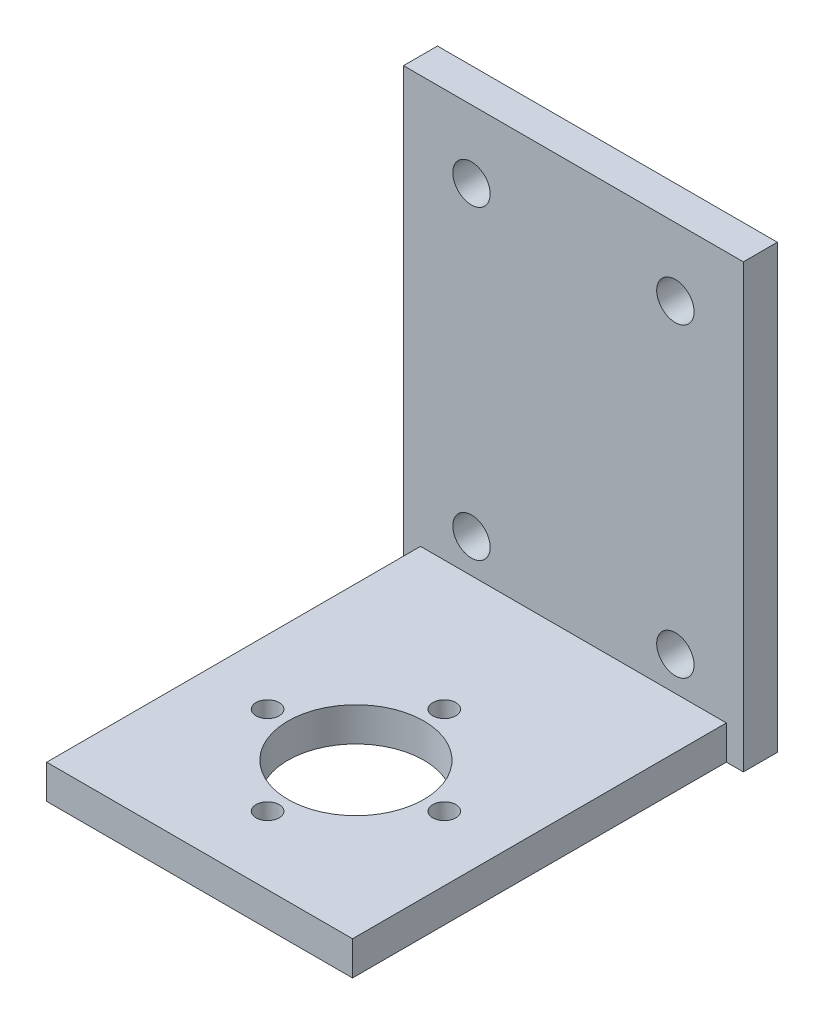
ISO-10303-21;
HEADER;
FILE_DESCRIPTION(('STEP AP214'),'2;1');
FILE_NAME('part.step','',(''),(''),'','','');
FILE_SCHEMA(('AUTOMOTIVE_DESIGN { 1 0 10303 214 1 1 1 1 }'));
ENDSEC;
DATA;
#1=APPLICATION_CONTEXT('core data for automotive mechanical design processes');
#2=APPLICATION_PROTOCOL_DEFINITION('international standard','automotive_design',2000,#1);
#3=PRODUCT_CONTEXT('',#1,'mechanical');
#4=PRODUCT('Part','Part','',(#3));
#5=PRODUCT_RELATED_PRODUCT_CATEGORY('part','',(#4));
#6=PRODUCT_DEFINITION_FORMATION('','',#4);
#7=PRODUCT_DEFINITION_CONTEXT('part definition',#1,'design');
#8=PRODUCT_DEFINITION('design','',#6,#7);
#9=PRODUCT_DEFINITION_SHAPE('','',#8);
#10=(LENGTH_UNIT() NAMED_UNIT(*) SI_UNIT(.MILLI.,.METRE.));
#11=(NAMED_UNIT(*) PLANE_ANGLE_UNIT() SI_UNIT($,.RADIAN.));
#12=(NAMED_UNIT(*) SI_UNIT($,.STERADIAN.) SOLID_ANGLE_UNIT());
#13=UNCERTAINTY_MEASURE_WITH_UNIT(LENGTH_MEASURE(1.E-05),#10,'distance_accuracy_value','');
#14=(GEOMETRIC_REPRESENTATION_CONTEXT(3) GLOBAL_UNCERTAINTY_ASSIGNED_CONTEXT((#13)) GLOBAL_UNIT_ASSIGNED_CONTEXT((#10,
#11,#12)) REPRESENTATION_CONTEXT('',''));
#15=CARTESIAN_POINT('',(0.,0.,0.));
#16=DIRECTION('',(0.,0.,1.));
#17=DIRECTION('',(1.,0.,0.));
#18=AXIS2_PLACEMENT_3D('',#15,#16,#17);
#19=CARTESIAN_POINT('',(0.,0.,5.));
#20=DIRECTION('',(0.,0.,-1.));
#21=DIRECTION('',(-1.,0.,0.));
#22=AXIS2_PLACEMENT_3D('',#19,#20,#21);
#23=PLANE('',#22);
#24=CARTESIAN_POINT('',(15.,22.5,5.));
#25=DIRECTION('',(0.,0.,1.));
#26=DIRECTION('',(1.,0.,0.));
#27=AXIS2_PLACEMENT_3D('',#24,#25,#26);
#28=CIRCLE('',#27,2.75);
#29=CARTESIAN_POINT('',(17.75,22.5,5.));
#30=VERTEX_POINT('',#29);
#31=EDGE_CURVE('E372',#30,#30,#28,.T.);
#32=ORIENTED_EDGE('',*,*,#31,.F.);
#33=EDGE_LOOP('',(#32));
#34=FACE_BOUND('',#33,.T.);
#35=CARTESIAN_POINT('',(-15.,-22.5,5.));
#36=DIRECTION('',(0.,0.,1.));
#37=DIRECTION('',(1.,0.,0.));
#38=AXIS2_PLACEMENT_3D('',#35,#36,#37);
#39=CIRCLE('',#38,2.75);
#40=CARTESIAN_POINT('',(-12.25,-22.5,5.));
#41=VERTEX_POINT('',#40);
#42=EDGE_CURVE('E379',#41,#41,#39,.T.);
#43=ORIENTED_EDGE('',*,*,#42,.F.);
#44=EDGE_LOOP('',(#43));
#45=FACE_BOUND('',#44,.T.);
#46=CARTESIAN_POINT('',(15.,-22.5,5.));
#47=DIRECTION('',(0.,0.,1.));
#48=DIRECTION('',(1.,0.,0.));
#49=AXIS2_PLACEMENT_3D('',#46,#47,#48);
#50=CIRCLE('',#49,2.75);
#51=CARTESIAN_POINT('',(17.75,-22.5,5.));
#52=VERTEX_POINT('',#51);
#53=EDGE_CURVE('E392',#52,#52,#50,.T.);
#54=ORIENTED_EDGE('',*,*,#53,.F.);
#55=EDGE_LOOP('',(#54));
#56=FACE_BOUND('',#55,.T.);
#57=CARTESIAN_POINT('',(-15.,22.5,5.));
#58=DIRECTION('',(0.,0.,1.));
#59=DIRECTION('',(1.,0.,0.));
#60=AXIS2_PLACEMENT_3D('',#57,#58,#59);
#61=CIRCLE('',#60,2.75);
#62=CARTESIAN_POINT('',(-12.25,22.5,5.));
#63=VERTEX_POINT('',#62);
#64=EDGE_CURVE('E374',#63,#63,#61,.T.);
#65=ORIENTED_EDGE('',*,*,#64,.F.);
#66=EDGE_LOOP('',(#65));
#67=FACE_BOUND('',#66,.T.);
#68=DIRECTION('',(0.,-1.,0.));
#69=VECTOR('',#68,1.);
#70=CARTESIAN_POINT('',(-22.5,-32.5,5.));
#71=LINE('',#70,#69);
#72=CARTESIAN_POINT('',(-22.5,-27.5,5.));
#73=VERTEX_POINT('',#72);
#74=CARTESIAN_POINT('',(-22.5,-32.5,5.));
#75=VERTEX_POINT('',#74);
#76=EDGE_CURVE('E57',#73,#75,#71,.T.);
#77=ORIENTED_EDGE('',*,*,#76,.F.);
#78=DIRECTION('',(-1.,0.,0.));
#79=VECTOR('',#78,1.);
#80=CARTESIAN_POINT('',(-22.5,-27.5,5.));
#81=LINE('',#80,#79);
#82=CARTESIAN_POINT('',(22.5,-27.5,5.));
#83=VERTEX_POINT('',#82);
#84=EDGE_CURVE('E121',#83,#73,#81,.T.);
#85=ORIENTED_EDGE('',*,*,#84,.F.);
#86=DIRECTION('',(0.,1.,0.));
#87=VECTOR('',#86,1.);
#88=CARTESIAN_POINT('',(22.5,-27.5,5.));
#89=LINE('',#88,#87);
#90=CARTESIAN_POINT('',(22.5,-32.5,5.));
#91=VERTEX_POINT('',#90);
#92=EDGE_CURVE('E65',#91,#83,#89,.T.);
#93=ORIENTED_EDGE('',*,*,#92,.F.);
#94=DIRECTION('',(1.,0.,0.));
#95=VECTOR('',#94,1.);
#96=CARTESIAN_POINT('',(25.,-32.5,5.));
#97=LINE('',#96,#95);
#98=CARTESIAN_POINT('',(25.,-32.5,5.));
#99=VERTEX_POINT('',#98);
#100=EDGE_CURVE('E141',#91,#99,#97,.T.);
#101=ORIENTED_EDGE('',*,*,#100,.T.);
#102=DIRECTION('',(0.,1.,0.));
#103=VECTOR('',#102,1.);
#104=CARTESIAN_POINT('',(25.,-32.5,5.));
#105=LINE('',#104,#103);
#106=CARTESIAN_POINT('',(25.,32.5,5.));
#107=VERTEX_POINT('',#106);
#108=EDGE_CURVE('E148',#99,#107,#105,.T.);
#109=ORIENTED_EDGE('',*,*,#108,.T.);
#110=DIRECTION('',(-1.,0.,0.));
#111=VECTOR('',#110,1.);
#112=CARTESIAN_POINT('',(25.,32.5,5.));
#113=LINE('',#112,#111);
#114=CARTESIAN_POINT('',(-25.,32.5,5.));
#115=VERTEX_POINT('',#114);
#116=EDGE_CURVE('E140',#107,#115,#113,.T.);
#117=ORIENTED_EDGE('',*,*,#116,.T.);
#118=DIRECTION('',(0.,-1.,0.));
#119=VECTOR('',#118,1.);
#120=CARTESIAN_POINT('',(-25.,-32.5,5.));
#121=LINE('',#120,#119);
#122=CARTESIAN_POINT('',(-25.,-32.5,5.));
#123=VERTEX_POINT('',#122);
#124=EDGE_CURVE('E136',#115,#123,#121,.T.);
#125=ORIENTED_EDGE('',*,*,#124,.T.);
#126=EDGE_CURVE('E145',#123,#75,#97,.T.);
#127=ORIENTED_EDGE('',*,*,#126,.T.);
#128=EDGE_LOOP('',(#77,#85,#93,#101,#109,#117,#125,#127));
#129=FACE_BOUND('',#128,.T.);
#130=ADVANCED_FACE('F39',(#34,#45,#56,#67,#129),#23,.F.);
#131=CARTESIAN_POINT('',(25.,32.5,5.));
#132=DIRECTION('',(0.,-1.,0.));
#133=DIRECTION('',(0.,0.,-1.));
#134=AXIS2_PLACEMENT_3D('',#131,#132,#133);
#135=PLANE('',#134);
#136=DIRECTION('',(-1.,0.,0.));
#137=VECTOR('',#136,1.);
#138=CARTESIAN_POINT('',(25.,32.5,0.));
#139=LINE('',#138,#137);
#140=CARTESIAN_POINT('',(25.,32.5,0.));
#141=VERTEX_POINT('',#140);
#142=CARTESIAN_POINT('',(-25.,32.5,0.));
#143=VERTEX_POINT('',#142);
#144=EDGE_CURVE('E126',#141,#143,#139,.T.);
#145=ORIENTED_EDGE('',*,*,#144,.T.);
#146=DIRECTION('',(0.,0.,-1.));
#147=VECTOR('',#146,1.);
#148=CARTESIAN_POINT('',(-25.,32.5,5.));
#149=LINE('',#148,#147);
#150=EDGE_CURVE('E11',#115,#143,#149,.T.);
#151=ORIENTED_EDGE('',*,*,#150,.F.);
#152=ORIENTED_EDGE('',*,*,#116,.F.);
#153=DIRECTION('',(0.,0.,-1.));
#154=VECTOR('',#153,1.);
#155=CARTESIAN_POINT('',(25.,32.5,5.));
#156=LINE('',#155,#154);
#157=EDGE_CURVE('E150',#107,#141,#156,.T.);
#158=ORIENTED_EDGE('',*,*,#157,.T.);
#159=EDGE_LOOP('',(#145,#151,#152,#158));
#160=FACE_BOUND('',#159,.T.);
#161=ADVANCED_FACE('F41',(#160),#135,.F.);
#162=CARTESIAN_POINT('',(-25.,-32.5,5.));
#163=DIRECTION('',(1.,0.,0.));
#164=DIRECTION('',(0.,0.,-1.));
#165=AXIS2_PLACEMENT_3D('',#162,#163,#164);
#166=PLANE('',#165);
#167=DIRECTION('',(0.,-1.,0.));
#168=VECTOR('',#167,1.);
#169=CARTESIAN_POINT('',(-25.,-32.5,0.));
#170=LINE('',#169,#168);
#171=CARTESIAN_POINT('',(-25.,-32.5,0.));
#172=VERTEX_POINT('',#171);
#173=EDGE_CURVE('E132',#143,#172,#170,.T.);
#174=ORIENTED_EDGE('',*,*,#173,.T.);
#175=DIRECTION('',(0.,0.,-1.));
#176=VECTOR('',#175,1.);
#177=CARTESIAN_POINT('',(-25.,-32.5,5.));
#178=LINE('',#177,#176);
#179=EDGE_CURVE('E48',#123,#172,#178,.T.);
#180=ORIENTED_EDGE('',*,*,#179,.F.);
#181=ORIENTED_EDGE('',*,*,#124,.F.);
#182=ORIENTED_EDGE('',*,*,#150,.T.);
#183=EDGE_LOOP('',(#174,#180,#181,#182));
#184=FACE_BOUND('',#183,.T.);
#185=ADVANCED_FACE('F214',(#184),#166,.F.);
#186=CARTESIAN_POINT('',(25.,-32.5,5.));
#187=DIRECTION('',(0.,1.,0.));
#188=DIRECTION('',(0.,0.,1.));
#189=AXIS2_PLACEMENT_3D('',#186,#187,#188);
#190=PLANE('',#189);
#191=CARTESIAN_POINT('',(0.,-32.5,50.));
#192=DIRECTION('',(0.,-1.,0.));
#193=DIRECTION('',(0.,0.,-1.));
#194=AXIS2_PLACEMENT_3D('',#191,#192,#193);
#195=CIRCLE('',#194,1.7);
#196=CARTESIAN_POINT('',(0.,-32.5,48.3));
#197=VERTEX_POINT('',#196);
#198=EDGE_CURVE('E169',#197,#197,#195,.T.);
#199=ORIENTED_EDGE('',*,*,#198,.F.);
#200=EDGE_LOOP('',(#199));
#201=FACE_BOUND('',#200,.T.);
#202=CARTESIAN_POINT('',(13.,-32.5,37.));
#203=DIRECTION('',(0.,-1.,0.));
#204=DIRECTION('',(0.,0.,-1.));
#205=AXIS2_PLACEMENT_3D('',#202,#203,#204);
#206=CIRCLE('',#205,1.7);
#207=CARTESIAN_POINT('',(13.,-32.5,35.3));
#208=VERTEX_POINT('',#207);
#209=EDGE_CURVE('E397',#208,#208,#206,.T.);
#210=ORIENTED_EDGE('',*,*,#209,.F.);
#211=EDGE_LOOP('',(#210));
#212=FACE_BOUND('',#211,.T.);
#213=CARTESIAN_POINT('',(0.,-32.5,24.));
#214=DIRECTION('',(0.,-1.,0.));
#215=DIRECTION('',(0.,0.,-1.));
#216=AXIS2_PLACEMENT_3D('',#213,#214,#215);
#217=CIRCLE('',#216,1.7);
#218=CARTESIAN_POINT('',(0.,-32.5,22.3));
#219=VERTEX_POINT('',#218);
#220=EDGE_CURVE('E398',#219,#219,#217,.T.);
#221=ORIENTED_EDGE('',*,*,#220,.F.);
#222=EDGE_LOOP('',(#221));
#223=FACE_BOUND('',#222,.T.);
#224=CARTESIAN_POINT('',(-13.,-32.5,37.));
#225=DIRECTION('',(0.,-1.,0.));
#226=DIRECTION('',(0.,0.,-1.));
#227=AXIS2_PLACEMENT_3D('',#224,#225,#226);
#228=CIRCLE('',#227,1.7);
#229=CARTESIAN_POINT('',(-13.,-32.5,35.3));
#230=VERTEX_POINT('',#229);
#231=EDGE_CURVE('E185',#230,#230,#228,.T.);
#232=ORIENTED_EDGE('',*,*,#231,.F.);
#233=EDGE_LOOP('',(#232));
#234=FACE_BOUND('',#233,.T.);
#235=CARTESIAN_POINT('',(0.,-32.5,37.));
#236=DIRECTION('',(0.,-1.,0.));
#237=DIRECTION('',(0.,0.,-1.));
#238=AXIS2_PLACEMENT_3D('',#235,#236,#237);
#239=CIRCLE('',#238,10.);
#240=CARTESIAN_POINT('',(0.,-32.5,27.));
#241=VERTEX_POINT('',#240);
#242=EDGE_CURVE('E162',#241,#241,#239,.T.);
#243=ORIENTED_EDGE('',*,*,#242,.F.);
#244=EDGE_LOOP('',(#243));
#245=FACE_BOUND('',#244,.T.);
#246=DIRECTION('',(1.,0.,0.));
#247=VECTOR('',#246,1.);
#248=CARTESIAN_POINT('',(25.,-32.5,0.));
#249=LINE('',#248,#247);
#250=CARTESIAN_POINT('',(25.,-32.5,0.));
#251=VERTEX_POINT('',#250);
#252=EDGE_CURVE('E147',#172,#251,#249,.T.);
#253=ORIENTED_EDGE('',*,*,#252,.T.);
#254=DIRECTION('',(0.,0.,-1.));
#255=VECTOR('',#254,1.);
#256=CARTESIAN_POINT('',(25.,-32.5,5.));
#257=LINE('',#256,#255);
#258=EDGE_CURVE('E154',#99,#251,#257,.T.);
#259=ORIENTED_EDGE('',*,*,#258,.F.);
#260=ORIENTED_EDGE('',*,*,#100,.F.);
#261=DIRECTION('',(0.,0.,-1.));
#262=VECTOR('',#261,1.);
#263=CARTESIAN_POINT('',(22.5,-32.5,60.));
#264=LINE('',#263,#262);
#265=CARTESIAN_POINT('',(22.5,-32.5,60.));
#266=VERTEX_POINT('',#265);
#267=EDGE_CURVE('E115',#266,#91,#264,.T.);
#268=ORIENTED_EDGE('',*,*,#267,.F.);
#269=DIRECTION('',(1.,0.,0.));
#270=VECTOR('',#269,1.);
#271=CARTESIAN_POINT('',(0.,-32.5,60.));
#272=LINE('',#271,#270);
#273=CARTESIAN_POINT('',(-22.5,-32.5,60.));
#274=VERTEX_POINT('',#273);
#275=EDGE_CURVE('E104',#274,#266,#272,.T.);
#276=ORIENTED_EDGE('',*,*,#275,.F.);
#277=DIRECTION('',(0.,0.,-1.));
#278=VECTOR('',#277,1.);
#279=CARTESIAN_POINT('',(-22.5,-32.5,60.));
#280=LINE('',#279,#278);
#281=EDGE_CURVE('E109',#274,#75,#280,.T.);
#282=ORIENTED_EDGE('',*,*,#281,.T.);
#283=ORIENTED_EDGE('',*,*,#126,.F.);
#284=ORIENTED_EDGE('',*,*,#179,.T.);
#285=EDGE_LOOP('',(#253,#259,#260,#268,#276,#282,#283,#284));
#286=FACE_BOUND('',#285,.T.);
#287=ADVANCED_FACE('F110',(#201,#212,#223,#234,#245,#286),#190,.F.);
#288=CARTESIAN_POINT('',(25.,-32.5,5.));
#289=DIRECTION('',(-1.,0.,0.));
#290=DIRECTION('',(0.,0.,1.));
#291=AXIS2_PLACEMENT_3D('',#288,#289,#290);
#292=PLANE('',#291);
#293=DIRECTION('',(0.,1.,0.));
#294=VECTOR('',#293,1.);
#295=CARTESIAN_POINT('',(25.,-32.5,0.));
#296=LINE('',#295,#294);
#297=EDGE_CURVE('E143',#251,#141,#296,.T.);
#298=ORIENTED_EDGE('',*,*,#297,.T.);
#299=ORIENTED_EDGE('',*,*,#157,.F.);
#300=ORIENTED_EDGE('',*,*,#108,.F.);
#301=ORIENTED_EDGE('',*,*,#258,.T.);
#302=EDGE_LOOP('',(#298,#299,#300,#301));
#303=FACE_BOUND('',#302,.T.);
#304=ADVANCED_FACE('F222',(#303),#292,.F.);
#305=CARTESIAN_POINT('',(0.,0.,0.));
#306=DIRECTION('',(0.,0.,-1.));
#307=DIRECTION('',(-1.,0.,0.));
#308=AXIS2_PLACEMENT_3D('',#305,#306,#307);
#309=PLANE('',#308);
#310=CARTESIAN_POINT('',(15.,22.5,0.));
#311=DIRECTION('',(0.,0.,1.));
#312=DIRECTION('',(1.,0.,0.));
#313=AXIS2_PLACEMENT_3D('',#310,#311,#312);
#314=CIRCLE('',#313,2.75);
#315=CARTESIAN_POINT('',(17.75,22.5,0.));
#316=VERTEX_POINT('',#315);
#317=EDGE_CURVE('E375',#316,#316,#314,.T.);
#318=ORIENTED_EDGE('',*,*,#317,.T.);
#319=EDGE_LOOP('',(#318));
#320=FACE_BOUND('',#319,.T.);
#321=CARTESIAN_POINT('',(-15.,-22.5,0.));
#322=DIRECTION('',(0.,0.,1.));
#323=DIRECTION('',(1.,0.,0.));
#324=AXIS2_PLACEMENT_3D('',#321,#322,#323);
#325=CIRCLE('',#324,2.75);
#326=CARTESIAN_POINT('',(-12.25,-22.5,0.));
#327=VERTEX_POINT('',#326);
#328=EDGE_CURVE('E389',#327,#327,#325,.T.);
#329=ORIENTED_EDGE('',*,*,#328,.T.);
#330=EDGE_LOOP('',(#329));
#331=FACE_BOUND('',#330,.T.);
#332=CARTESIAN_POINT('',(15.,-22.5,0.));
#333=DIRECTION('',(0.,0.,1.));
#334=DIRECTION('',(1.,0.,0.));
#335=AXIS2_PLACEMENT_3D('',#332,#333,#334);
#336=CIRCLE('',#335,2.75);
#337=CARTESIAN_POINT('',(17.75,-22.5,0.));
#338=VERTEX_POINT('',#337);
#339=EDGE_CURVE('E382',#338,#338,#336,.T.);
#340=ORIENTED_EDGE('',*,*,#339,.T.);
#341=EDGE_LOOP('',(#340));
#342=FACE_BOUND('',#341,.T.);
#343=CARTESIAN_POINT('',(-15.,22.5,0.));
#344=DIRECTION('',(0.,0.,1.));
#345=DIRECTION('',(1.,0.,0.));
#346=AXIS2_PLACEMENT_3D('',#343,#344,#345);
#347=CIRCLE('',#346,2.75);
#348=CARTESIAN_POINT('',(-12.25,22.5,0.));
#349=VERTEX_POINT('',#348);
#350=EDGE_CURVE('E378',#349,#349,#347,.T.);
#351=ORIENTED_EDGE('',*,*,#350,.T.);
#352=EDGE_LOOP('',(#351));
#353=FACE_BOUND('',#352,.T.);
#354=ORIENTED_EDGE('',*,*,#144,.F.);
#355=ORIENTED_EDGE('',*,*,#297,.F.);
#356=ORIENTED_EDGE('',*,*,#252,.F.);
#357=ORIENTED_EDGE('',*,*,#173,.F.);
#358=EDGE_LOOP('',(#354,#355,#356,#357));
#359=FACE_BOUND('',#358,.T.);
#360=ADVANCED_FACE('F202',(#320,#331,#342,#353,#359),#309,.T.);
#361=CARTESIAN_POINT('',(-22.5,-32.5,60.));
#362=DIRECTION('',(1.,0.,0.));
#363=DIRECTION('',(0.,0.,-1.));
#364=AXIS2_PLACEMENT_3D('',#361,#362,#363);
#365=PLANE('',#364);
#366=ORIENTED_EDGE('',*,*,#76,.T.);
#367=ORIENTED_EDGE('',*,*,#281,.F.);
#368=DIRECTION('',(0.,-1.,0.));
#369=VECTOR('',#368,1.);
#370=CARTESIAN_POINT('',(-22.5,-32.5,60.));
#371=LINE('',#370,#369);
#372=CARTESIAN_POINT('',(-22.5,-27.5,60.));
#373=VERTEX_POINT('',#372);
#374=EDGE_CURVE('E117',#373,#274,#371,.T.);
#375=ORIENTED_EDGE('',*,*,#374,.F.);
#376=DIRECTION('',(0.,0.,-1.));
#377=VECTOR('',#376,1.);
#378=CARTESIAN_POINT('',(-22.5,-27.5,60.));
#379=LINE('',#378,#377);
#380=EDGE_CURVE('E190',#373,#73,#379,.T.);
#381=ORIENTED_EDGE('',*,*,#380,.T.);
#382=EDGE_LOOP('',(#366,#367,#375,#381));
#383=FACE_BOUND('',#382,.T.);
#384=ADVANCED_FACE('F130',(#383),#365,.F.);
#385=CARTESIAN_POINT('',(22.5,-27.5,60.));
#386=DIRECTION('',(-1.,0.,0.));
#387=DIRECTION('',(0.,0.,1.));
#388=AXIS2_PLACEMENT_3D('',#385,#386,#387);
#389=PLANE('',#388);
#390=ORIENTED_EDGE('',*,*,#92,.T.);
#391=DIRECTION('',(0.,0.,-1.));
#392=VECTOR('',#391,1.);
#393=CARTESIAN_POINT('',(22.5,-27.5,60.));
#394=LINE('',#393,#392);
#395=CARTESIAN_POINT('',(22.5,-27.5,60.));
#396=VERTEX_POINT('',#395);
#397=EDGE_CURVE('E134',#396,#83,#394,.T.);
#398=ORIENTED_EDGE('',*,*,#397,.F.);
#399=DIRECTION('',(0.,1.,0.));
#400=VECTOR('',#399,1.);
#401=CARTESIAN_POINT('',(22.5,-27.5,60.));
#402=LINE('',#401,#400);
#403=EDGE_CURVE('E113',#266,#396,#402,.T.);
#404=ORIENTED_EDGE('',*,*,#403,.F.);
#405=ORIENTED_EDGE('',*,*,#267,.T.);
#406=EDGE_LOOP('',(#390,#398,#404,#405));
#407=FACE_BOUND('',#406,.T.);
#408=ADVANCED_FACE('F198',(#407),#389,.F.);
#409=CARTESIAN_POINT('',(-22.5,-27.5,60.));
#410=DIRECTION('',(0.,-1.,0.));
#411=DIRECTION('',(0.,0.,-1.));
#412=AXIS2_PLACEMENT_3D('',#409,#410,#411);
#413=PLANE('',#412);
#414=CARTESIAN_POINT('',(0.,-27.5,50.));
#415=DIRECTION('',(0.,-1.,0.));
#416=DIRECTION('',(0.,0.,-1.));
#417=AXIS2_PLACEMENT_3D('',#414,#415,#416);
#418=CIRCLE('',#417,1.7);
#419=CARTESIAN_POINT('',(0.,-27.5,48.3));
#420=VERTEX_POINT('',#419);
#421=EDGE_CURVE('E43',#420,#420,#418,.T.);
#422=ORIENTED_EDGE('',*,*,#421,.T.);
#423=EDGE_LOOP('',(#422));
#424=FACE_BOUND('',#423,.T.);
#425=CARTESIAN_POINT('',(13.,-27.5,37.));
#426=DIRECTION('',(0.,-1.,0.));
#427=DIRECTION('',(0.,0.,-1.));
#428=AXIS2_PLACEMENT_3D('',#425,#426,#427);
#429=CIRCLE('',#428,1.7);
#430=CARTESIAN_POINT('',(13.,-27.5,35.3));
#431=VERTEX_POINT('',#430);
#432=EDGE_CURVE('E168',#431,#431,#429,.T.);
#433=ORIENTED_EDGE('',*,*,#432,.T.);
#434=EDGE_LOOP('',(#433));
#435=FACE_BOUND('',#434,.T.);
#436=CARTESIAN_POINT('',(0.,-27.5,24.));
#437=DIRECTION('',(0.,-1.,0.));
#438=DIRECTION('',(0.,0.,-1.));
#439=AXIS2_PLACEMENT_3D('',#436,#437,#438);
#440=CIRCLE('',#439,1.7);
#441=CARTESIAN_POINT('',(0.,-27.5,22.3));
#442=VERTEX_POINT('',#441);
#443=EDGE_CURVE('E170',#442,#442,#440,.T.);
#444=ORIENTED_EDGE('',*,*,#443,.T.);
#445=EDGE_LOOP('',(#444));
#446=FACE_BOUND('',#445,.T.);
#447=CARTESIAN_POINT('',(-13.,-27.5,37.));
#448=DIRECTION('',(0.,-1.,0.));
#449=DIRECTION('',(0.,0.,-1.));
#450=AXIS2_PLACEMENT_3D('',#447,#448,#449);
#451=CIRCLE('',#450,1.7);
#452=CARTESIAN_POINT('',(-13.,-27.5,35.3));
#453=VERTEX_POINT('',#452);
#454=EDGE_CURVE('E163',#453,#453,#451,.T.);
#455=ORIENTED_EDGE('',*,*,#454,.T.);
#456=EDGE_LOOP('',(#455));
#457=FACE_BOUND('',#456,.T.);
#458=CARTESIAN_POINT('',(0.,-27.5,37.));
#459=DIRECTION('',(0.,-1.,0.));
#460=DIRECTION('',(0.,0.,-1.));
#461=AXIS2_PLACEMENT_3D('',#458,#459,#460);
#462=CIRCLE('',#461,10.);
#463=CARTESIAN_POINT('',(0.,-27.5,27.));
#464=VERTEX_POINT('',#463);
#465=EDGE_CURVE('E159',#464,#464,#462,.T.);
#466=ORIENTED_EDGE('',*,*,#465,.T.);
#467=EDGE_LOOP('',(#466));
#468=FACE_BOUND('',#467,.T.);
#469=ORIENTED_EDGE('',*,*,#84,.T.);
#470=ORIENTED_EDGE('',*,*,#380,.F.);
#471=DIRECTION('',(-1.,0.,0.));
#472=VECTOR('',#471,1.);
#473=CARTESIAN_POINT('',(-22.5,-27.5,60.));
#474=LINE('',#473,#472);
#475=EDGE_CURVE('E122',#396,#373,#474,.T.);
#476=ORIENTED_EDGE('',*,*,#475,.F.);
#477=ORIENTED_EDGE('',*,*,#397,.T.);
#478=EDGE_LOOP('',(#469,#470,#476,#477));
#479=FACE_BOUND('',#478,.T.);
#480=ADVANCED_FACE('F194',(#424,#435,#446,#457,#468,#479),#413,.F.);
#481=CARTESIAN_POINT('',(0.,0.,60.));
#482=DIRECTION('',(0.,0.,-1.));
#483=DIRECTION('',(-1.,0.,0.));
#484=AXIS2_PLACEMENT_3D('',#481,#482,#483);
#485=PLANE('',#484);
#486=ORIENTED_EDGE('',*,*,#374,.T.);
#487=ORIENTED_EDGE('',*,*,#275,.T.);
#488=ORIENTED_EDGE('',*,*,#403,.T.);
#489=ORIENTED_EDGE('',*,*,#475,.T.);
#490=EDGE_LOOP('',(#486,#487,#488,#489));
#491=FACE_BOUND('',#490,.T.);
#492=ADVANCED_FACE('F116',(#491),#485,.F.);
#493=CARTESIAN_POINT('',(0.,32.5,37.));
#494=DIRECTION('',(0.,-1.,0.));
#495=DIRECTION('',(0.,0.,-1.));
#496=AXIS2_PLACEMENT_3D('',#493,#494,#495);
#497=CYLINDRICAL_SURFACE('',#496,10.);
#498=ORIENTED_EDGE('',*,*,#242,.T.);
#499=EDGE_LOOP('',(#498));
#500=FACE_BOUND('',#499,.T.);
#501=ORIENTED_EDGE('',*,*,#465,.F.);
#502=EDGE_LOOP('',(#501));
#503=FACE_BOUND('',#502,.T.);
#504=ADVANCED_FACE('F278',(#500,#503),#497,.F.);
#505=CARTESIAN_POINT('',(-13.,32.5,37.));
#506=DIRECTION('',(0.,-1.,0.));
#507=DIRECTION('',(0.,0.,-1.));
#508=AXIS2_PLACEMENT_3D('',#505,#506,#507);
#509=CYLINDRICAL_SURFACE('',#508,1.7);
#510=ORIENTED_EDGE('',*,*,#231,.T.);
#511=EDGE_LOOP('',(#510));
#512=FACE_BOUND('',#511,.T.);
#513=ORIENTED_EDGE('',*,*,#454,.F.);
#514=EDGE_LOOP('',(#513));
#515=FACE_BOUND('',#514,.T.);
#516=ADVANCED_FACE('F289',(#512,#515),#509,.F.);
#517=CARTESIAN_POINT('',(0.,32.5,24.));
#518=DIRECTION('',(0.,-1.,0.));
#519=DIRECTION('',(0.,0.,-1.));
#520=AXIS2_PLACEMENT_3D('',#517,#518,#519);
#521=CYLINDRICAL_SURFACE('',#520,1.7);
#522=ORIENTED_EDGE('',*,*,#220,.T.);
#523=EDGE_LOOP('',(#522));
#524=FACE_BOUND('',#523,.T.);
#525=ORIENTED_EDGE('',*,*,#443,.F.);
#526=EDGE_LOOP('',(#525));
#527=FACE_BOUND('',#526,.T.);
#528=ADVANCED_FACE('F300',(#524,#527),#521,.F.);
#529=CARTESIAN_POINT('',(13.,32.5,37.));
#530=DIRECTION('',(0.,-1.,0.));
#531=DIRECTION('',(0.,0.,-1.));
#532=AXIS2_PLACEMENT_3D('',#529,#530,#531);
#533=CYLINDRICAL_SURFACE('',#532,1.7);
#534=ORIENTED_EDGE('',*,*,#209,.T.);
#535=EDGE_LOOP('',(#534));
#536=FACE_BOUND('',#535,.T.);
#537=ORIENTED_EDGE('',*,*,#432,.F.);
#538=EDGE_LOOP('',(#537));
#539=FACE_BOUND('',#538,.T.);
#540=ADVANCED_FACE('F307',(#536,#539),#533,.F.);
#541=CARTESIAN_POINT('',(0.,32.5,50.));
#542=DIRECTION('',(0.,-1.,0.));
#543=DIRECTION('',(0.,0.,-1.));
#544=AXIS2_PLACEMENT_3D('',#541,#542,#543);
#545=CYLINDRICAL_SURFACE('',#544,1.7);
#546=ORIENTED_EDGE('',*,*,#198,.T.);
#547=EDGE_LOOP('',(#546));
#548=FACE_BOUND('',#547,.T.);
#549=ORIENTED_EDGE('',*,*,#421,.F.);
#550=EDGE_LOOP('',(#549));
#551=FACE_BOUND('',#550,.T.);
#552=ADVANCED_FACE('F320',(#548,#551),#545,.F.);
#553=CARTESIAN_POINT('',(-15.,22.5,0.));
#554=DIRECTION('',(0.,0.,1.));
#555=DIRECTION('',(1.,0.,0.));
#556=AXIS2_PLACEMENT_3D('',#553,#554,#555);
#557=CYLINDRICAL_SURFACE('',#556,2.75);
#558=ORIENTED_EDGE('',*,*,#350,.F.);
#559=EDGE_LOOP('',(#558));
#560=FACE_BOUND('',#559,.T.);
#561=ORIENTED_EDGE('',*,*,#64,.T.);
#562=EDGE_LOOP('',(#561));
#563=FACE_BOUND('',#562,.T.);
#564=ADVANCED_FACE('F326',(#560,#563),#557,.F.);
#565=CARTESIAN_POINT('',(15.,-22.5,0.));
#566=DIRECTION('',(0.,0.,1.));
#567=DIRECTION('',(1.,0.,0.));
#568=AXIS2_PLACEMENT_3D('',#565,#566,#567);
#569=CYLINDRICAL_SURFACE('',#568,2.75);
#570=ORIENTED_EDGE('',*,*,#339,.F.);
#571=EDGE_LOOP('',(#570));
#572=FACE_BOUND('',#571,.T.);
#573=ORIENTED_EDGE('',*,*,#53,.T.);
#574=EDGE_LOOP('',(#573));
#575=FACE_BOUND('',#574,.T.);
#576=ADVANCED_FACE('F337',(#572,#575),#569,.F.);
#577=CARTESIAN_POINT('',(-15.,-22.5,0.));
#578=DIRECTION('',(0.,0.,1.));
#579=DIRECTION('',(1.,0.,0.));
#580=AXIS2_PLACEMENT_3D('',#577,#578,#579);
#581=CYLINDRICAL_SURFACE('',#580,2.75);
#582=ORIENTED_EDGE('',*,*,#328,.F.);
#583=EDGE_LOOP('',(#582));
#584=FACE_BOUND('',#583,.T.);
#585=ORIENTED_EDGE('',*,*,#42,.T.);
#586=EDGE_LOOP('',(#585));
#587=FACE_BOUND('',#586,.T.);
#588=ADVANCED_FACE('F347',(#584,#587),#581,.F.);
#589=CARTESIAN_POINT('',(15.,22.5,0.));
#590=DIRECTION('',(0.,0.,1.));
#591=DIRECTION('',(1.,0.,0.));
#592=AXIS2_PLACEMENT_3D('',#589,#590,#591);
#593=CYLINDRICAL_SURFACE('',#592,2.75);
#594=ORIENTED_EDGE('',*,*,#317,.F.);
#595=EDGE_LOOP('',(#594));
#596=FACE_BOUND('',#595,.T.);
#597=ORIENTED_EDGE('',*,*,#31,.T.);
#598=EDGE_LOOP('',(#597));
#599=FACE_BOUND('',#598,.T.);
#600=ADVANCED_FACE('F357',(#596,#599),#593,.F.);
#601=CLOSED_SHELL('',(#130,#161,#185,#287,#304,#360,#384,#408,#480,#492,#504,#516,#528,#540,
#552,#564,#576,#588,#600));
#602=MANIFOLD_SOLID_BREP('B2',#601);
#603=ADVANCED_BREP_SHAPE_REPRESENTATION('',(#18,#602),#14);
#604=SHAPE_DEFINITION_REPRESENTATION(#9,#603);
ENDSEC;
END-ISO-10303-21;
